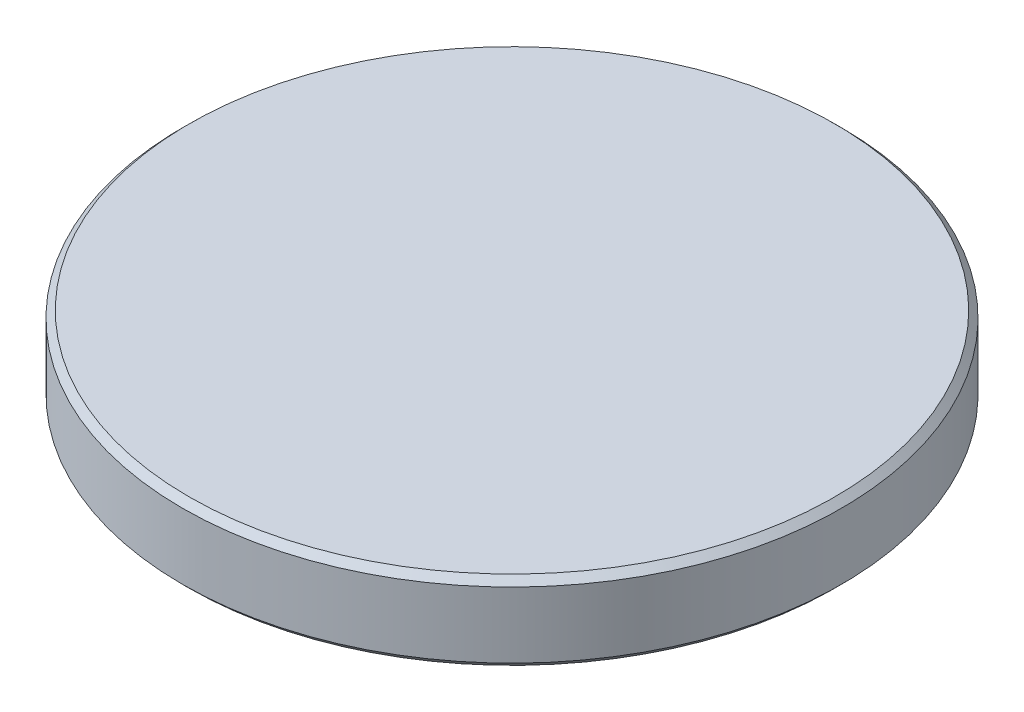
ISO-10303-21;
HEADER;
FILE_DESCRIPTION(('STEP AP214'),'2;1');
FILE_NAME('part.step','',(''),(''),'','','');
FILE_SCHEMA(('AUTOMOTIVE_DESIGN { 1 0 10303 214 1 1 1 1 }'));
ENDSEC;
DATA;
#1=APPLICATION_CONTEXT('core data for automotive mechanical design processes');
#2=APPLICATION_PROTOCOL_DEFINITION('international standard','automotive_design',2000,#1);
#3=PRODUCT_CONTEXT('',#1,'mechanical');
#4=PRODUCT('Part','Part','',(#3));
#5=PRODUCT_RELATED_PRODUCT_CATEGORY('part','',(#4));
#6=PRODUCT_DEFINITION_FORMATION('','',#4);
#7=PRODUCT_DEFINITION_CONTEXT('part definition',#1,'design');
#8=PRODUCT_DEFINITION('design','',#6,#7);
#9=PRODUCT_DEFINITION_SHAPE('','',#8);
#10=(LENGTH_UNIT() NAMED_UNIT(*) SI_UNIT(.MILLI.,.METRE.));
#11=(NAMED_UNIT(*) PLANE_ANGLE_UNIT() SI_UNIT($,.RADIAN.));
#12=(NAMED_UNIT(*) SI_UNIT($,.STERADIAN.) SOLID_ANGLE_UNIT());
#13=UNCERTAINTY_MEASURE_WITH_UNIT(LENGTH_MEASURE(1.E-05),#10,'distance_accuracy_value','');
#14=(GEOMETRIC_REPRESENTATION_CONTEXT(3) GLOBAL_UNCERTAINTY_ASSIGNED_CONTEXT((#13)) GLOBAL_UNIT_ASSIGNED_CONTEXT((#10,
#11,#12)) REPRESENTATION_CONTEXT('',''));
#15=CARTESIAN_POINT('',(0.,0.,0.));
#16=DIRECTION('',(0.,0.,1.));
#17=DIRECTION('',(1.,0.,0.));
#18=AXIS2_PLACEMENT_3D('',#15,#16,#17);
#19=CARTESIAN_POINT('',(0.,3.,0.));
#20=DIRECTION('',(0.,-1.,0.));
#21=DIRECTION('',(0.,0.,-1.));
#22=AXIS2_PLACEMENT_3D('',#19,#20,#21);
#23=CYLINDRICAL_SURFACE('',#22,12.5);
#24=CARTESIAN_POINT('',(0.,0.249999999999995,0.));
#25=DIRECTION('',(0.,1.,0.));
#26=DIRECTION('',(0.,0.,1.));
#27=AXIS2_PLACEMENT_3D('',#24,#25,#26);
#28=CIRCLE('',#27,12.5);
#29=CARTESIAN_POINT('',(0.,0.249999999999995,12.5));
#30=VERTEX_POINT('',#29);
#31=EDGE_CURVE('E47',#30,#30,#28,.T.);
#32=ORIENTED_EDGE('',*,*,#31,.T.);
#33=EDGE_LOOP('',(#32));
#34=FACE_BOUND('',#33,.T.);
#35=CARTESIAN_POINT('',(0.,2.75,0.));
#36=DIRECTION('',(0.,1.,0.));
#37=DIRECTION('',(0.,0.,1.));
#38=AXIS2_PLACEMENT_3D('',#35,#36,#37);
#39=CIRCLE('',#38,12.5);
#40=CARTESIAN_POINT('',(0.,2.75,12.5));
#41=VERTEX_POINT('',#40);
#42=EDGE_CURVE('E51',#41,#41,#39,.F.);
#43=ORIENTED_EDGE('',*,*,#42,.T.);
#44=EDGE_LOOP('',(#43));
#45=FACE_BOUND('',#44,.T.);
#46=ADVANCED_FACE('F36',(#34,#45),#23,.T.);
#47=CARTESIAN_POINT('',(0.,3.,0.));
#48=DIRECTION('',(0.,1.,0.));
#49=DIRECTION('',(0.,0.,1.));
#50=AXIS2_PLACEMENT_3D('',#47,#48,#49);
#51=PLANE('',#50);
#52=CARTESIAN_POINT('',(0.,3.,0.));
#53=DIRECTION('',(0.,1.,0.));
#54=DIRECTION('',(0.,0.,1.));
#55=AXIS2_PLACEMENT_3D('',#52,#53,#54);
#56=CIRCLE('',#55,12.25);
#57=CARTESIAN_POINT('',(0.,3.,12.25));
#58=VERTEX_POINT('',#57);
#59=EDGE_CURVE('E10',#58,#58,#56,.T.);
#60=ORIENTED_EDGE('',*,*,#59,.T.);
#61=EDGE_LOOP('',(#60));
#62=FACE_BOUND('',#61,.T.);
#63=ADVANCED_FACE('F67',(#62),#51,.T.);
#64=CARTESIAN_POINT('',(0.,0.,0.));
#65=DIRECTION('',(0.,1.,0.));
#66=DIRECTION('',(0.,0.,1.));
#67=AXIS2_PLACEMENT_3D('',#64,#65,#66);
#68=PLANE('',#67);
#69=CARTESIAN_POINT('',(0.,0.,0.));
#70=DIRECTION('',(0.,1.,0.));
#71=DIRECTION('',(0.,0.,1.));
#72=AXIS2_PLACEMENT_3D('',#69,#70,#71);
#73=CIRCLE('',#72,12.25);
#74=CARTESIAN_POINT('',(0.,0.,12.25));
#75=VERTEX_POINT('',#74);
#76=EDGE_CURVE('E43',#75,#75,#73,.F.);
#77=ORIENTED_EDGE('',*,*,#76,.T.);
#78=EDGE_LOOP('',(#77));
#79=FACE_BOUND('',#78,.T.);
#80=ADVANCED_FACE('F64',(#79),#68,.F.);
#81=CARTESIAN_POINT('',(0.,0.249999999999995,0.));
#82=DIRECTION('',(0.,1.,0.));
#83=DIRECTION('',(0.,0.,1.));
#84=AXIS2_PLACEMENT_3D('',#81,#82,#83);
#85=CONICAL_SURFACE('',#84,12.5,0.785398163397452);
#86=ORIENTED_EDGE('',*,*,#76,.F.);
#87=EDGE_LOOP('',(#86));
#88=FACE_BOUND('',#87,.T.);
#89=ORIENTED_EDGE('',*,*,#31,.F.);
#90=EDGE_LOOP('',(#89));
#91=FACE_BOUND('',#90,.T.);
#92=ADVANCED_FACE('F60',(#88,#91),#85,.T.);
#93=CARTESIAN_POINT('',(0.,3.,0.));
#94=DIRECTION('',(0.,-1.,0.));
#95=DIRECTION('',(0.,0.,-1.));
#96=AXIS2_PLACEMENT_3D('',#93,#94,#95);
#97=CONICAL_SURFACE('',#96,12.25,0.785398163397445);
#98=ORIENTED_EDGE('',*,*,#42,.F.);
#99=EDGE_LOOP('',(#98));
#100=FACE_BOUND('',#99,.T.);
#101=ORIENTED_EDGE('',*,*,#59,.F.);
#102=EDGE_LOOP('',(#101));
#103=FACE_BOUND('',#102,.T.);
#104=ADVANCED_FACE('F38',(#100,#103),#97,.T.);
#105=CLOSED_SHELL('',(#46,#63,#80,#92,#104));
#106=MANIFOLD_SOLID_BREP('B2',#105);
#107=ADVANCED_BREP_SHAPE_REPRESENTATION('',(#18,#106),#14);
#108=SHAPE_DEFINITION_REPRESENTATION(#9,#107);
ENDSEC;
END-ISO-10303-21;
